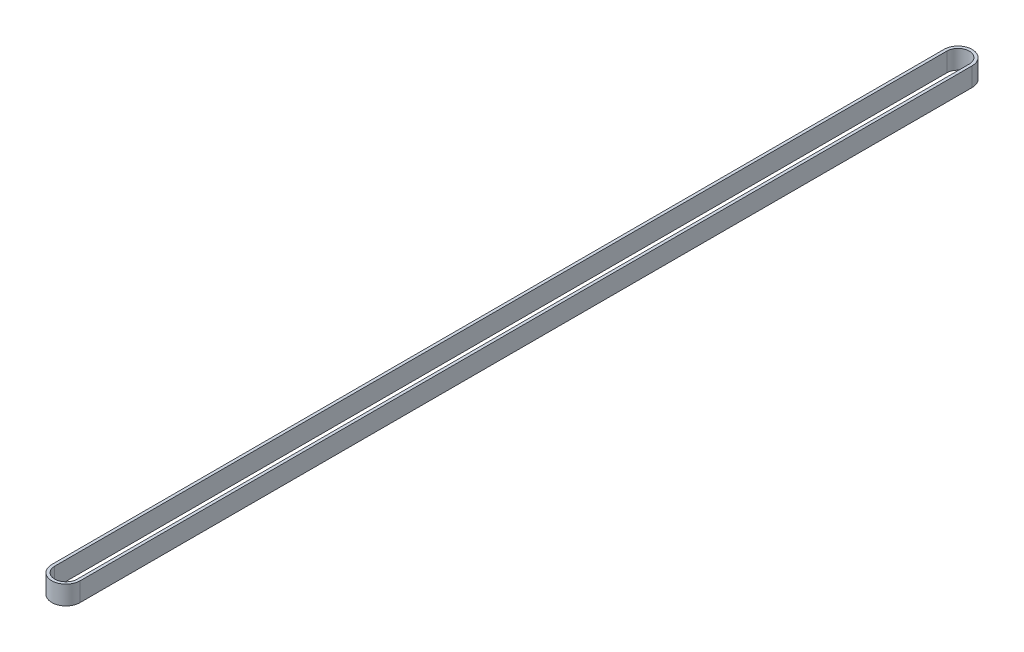
ISO-10303-21;
HEADER;
FILE_DESCRIPTION(('STEP AP214'),'2;1');
FILE_NAME('part.step','',(''),(''),'','','');
FILE_SCHEMA(('AUTOMOTIVE_DESIGN { 1 0 10303 214 1 1 1 1 }'));
ENDSEC;
DATA;
#1=APPLICATION_CONTEXT('core data for automotive mechanical design processes');
#2=APPLICATION_PROTOCOL_DEFINITION('international standard','automotive_design',2000,#1);
#3=PRODUCT_CONTEXT('',#1,'mechanical');
#4=PRODUCT('Part','Part','',(#3));
#5=PRODUCT_RELATED_PRODUCT_CATEGORY('part','',(#4));
#6=PRODUCT_DEFINITION_FORMATION('','',#4);
#7=PRODUCT_DEFINITION_CONTEXT('part definition',#1,'design');
#8=PRODUCT_DEFINITION('design','',#6,#7);
#9=PRODUCT_DEFINITION_SHAPE('','',#8);
#10=(LENGTH_UNIT() NAMED_UNIT(*) SI_UNIT(.MILLI.,.METRE.));
#11=(NAMED_UNIT(*) PLANE_ANGLE_UNIT() SI_UNIT($,.RADIAN.));
#12=(NAMED_UNIT(*) SI_UNIT($,.STERADIAN.) SOLID_ANGLE_UNIT());
#13=UNCERTAINTY_MEASURE_WITH_UNIT(LENGTH_MEASURE(1.E-05),#10,'distance_accuracy_value','');
#14=(GEOMETRIC_REPRESENTATION_CONTEXT(3) GLOBAL_UNCERTAINTY_ASSIGNED_CONTEXT((#13)) GLOBAL_UNIT_ASSIGNED_CONTEXT((#10,
#11,#12)) REPRESENTATION_CONTEXT('',''));
#15=CARTESIAN_POINT('',(0.,0.,0.));
#16=DIRECTION('',(0.,0.,1.));
#17=DIRECTION('',(1.,0.,0.));
#18=AXIS2_PLACEMENT_3D('',#15,#16,#17);
#19=CARTESIAN_POINT('',(305.200009584209,332.350083923345,124.990878974955));
#20=DIRECTION('',(0.,1.,0.));
#21=DIRECTION('',(1.,0.,0.));
#22=AXIS2_PLACEMENT_3D('',#19,#20,#21);
#23=PLANE('',#22);
#24=DIRECTION('',(1.1227384648365E-06,0.,0.99999999999937));
#25=VECTOR('',#24,1.);
#26=CARTESIAN_POINT('',(310.561009584206,332.350083923345,337.077760231628));
#27=LINE('',#26,#25);
#28=CARTESIAN_POINT('',(310.560532225255,332.350083923345,-88.0960143197193));
#29=VERTEX_POINT('',#28);
#30=CARTESIAN_POINT('',(310.561009584206,332.350083923345,337.077760231628));
#31=VERTEX_POINT('',#30);
#32=EDGE_CURVE('E148',#29,#31,#27,.T.);
#33=ORIENTED_EDGE('',*,*,#32,.T.);
#34=CARTESIAN_POINT('',(305.200009584209,332.350083923345,337.077766250629));
#35=DIRECTION('',(0.,-1.,0.));
#36=DIRECTION('',(-0.99999999999937,0.,1.12273846420003E-06));
#37=AXIS2_PLACEMENT_3D('',#34,#35,#36);
#38=CIRCLE('',#37,5.361);
#39=CARTESIAN_POINT('',(299.839009584212,332.350083923345,337.07777226963));
#40=VERTEX_POINT('',#39);
#41=EDGE_CURVE('E135',#31,#40,#38,.T.);
#42=ORIENTED_EDGE('',*,*,#41,.T.);
#43=DIRECTION('',(-1.12273846477905E-06,0.,-0.99999999999937));
#44=VECTOR('',#43,1.);
#45=CARTESIAN_POINT('',(299.838532225261,332.350083923345,-88.0960022817175));
#46=LINE('',#45,#44);
#47=CARTESIAN_POINT('',(299.838532225261,332.350083923345,-88.0960022817175));
#48=VERTEX_POINT('',#47);
#49=EDGE_CURVE('E20',#40,#48,#46,.T.);
#50=ORIENTED_EDGE('',*,*,#49,.T.);
#51=CARTESIAN_POINT('',(305.199532225258,332.350083923345,-88.0960083007184));
#52=DIRECTION('',(0.,-1.,0.));
#53=DIRECTION('',(0.99999999999937,0.,-1.12273845467844E-06));
#54=AXIS2_PLACEMENT_3D('',#51,#52,#53);
#55=CIRCLE('',#54,5.361);
#56=EDGE_CURVE('E98',#48,#29,#55,.T.);
#57=ORIENTED_EDGE('',*,*,#56,.T.);
#58=EDGE_LOOP('',(#33,#42,#50,#57));
#59=FACE_BOUND('',#58,.T.);
#60=DIRECTION('',(-1.12273846483388E-06,0.,-0.99999999999937));
#61=VECTOR('',#60,1.);
#62=CARTESIAN_POINT('',(311.941009584205,332.350083923345,337.077758682249));
#63=LINE('',#62,#61);
#64=CARTESIAN_POINT('',(311.941009584205,332.350083923345,337.077758682249));
#65=VERTEX_POINT('',#64);
#66=CARTESIAN_POINT('',(311.940532225254,332.350083923345,-88.0960158690984));
#67=VERTEX_POINT('',#66);
#68=EDGE_CURVE('E11',#65,#67,#63,.T.);
#69=ORIENTED_EDGE('',*,*,#68,.T.);
#70=CARTESIAN_POINT('',(305.199532225258,332.350083923345,-88.0960083007184));
#71=DIRECTION('',(0.,1.,0.));
#72=DIRECTION('',(0.99999999999937,0.,-1.12273845629736E-06));
#73=AXIS2_PLACEMENT_3D('',#70,#71,#72);
#74=CIRCLE('',#73,6.741);
#75=CARTESIAN_POINT('',(298.458532225262,332.350083923345,-88.0960007323384));
#76=VERTEX_POINT('',#75);
#77=EDGE_CURVE('E176',#67,#76,#74,.T.);
#78=ORIENTED_EDGE('',*,*,#77,.T.);
#79=DIRECTION('',(1.12273846478166E-06,0.,0.99999999999937));
#80=VECTOR('',#79,1.);
#81=CARTESIAN_POINT('',(298.458532225262,332.350083923345,-88.0960007323384));
#82=LINE('',#81,#80);
#83=CARTESIAN_POINT('',(298.459009584213,332.350083923345,337.077773819009));
#84=VERTEX_POINT('',#83);
#85=EDGE_CURVE('E212',#76,#84,#82,.T.);
#86=ORIENTED_EDGE('',*,*,#85,.T.);
#87=CARTESIAN_POINT('',(305.200009584209,332.350083923345,337.077766250629));
#88=DIRECTION('',(0.,1.,0.));
#89=DIRECTION('',(-0.99999999999937,0.,1.12273846386971E-06));
#90=AXIS2_PLACEMENT_3D('',#87,#88,#89);
#91=CIRCLE('',#90,6.741);
#92=EDGE_CURVE('E202',#84,#65,#91,.T.);
#93=ORIENTED_EDGE('',*,*,#92,.T.);
#94=EDGE_LOOP('',(#69,#78,#86,#93));
#95=FACE_BOUND('',#94,.T.);
#96=ADVANCED_FACE('F17',(#59,#95),#23,.T.);
#97=CARTESIAN_POINT('',(311.941009584205,327.850083923345,337.077758682249));
#98=DIRECTION('',(0.99999999999937,0.,-1.12273846483388E-06));
#99=DIRECTION('',(0.,-1.,0.));
#100=AXIS2_PLACEMENT_3D('',#97,#98,#99);
#101=PLANE('',#100);
#102=DIRECTION('',(0.,1.,0.));
#103=VECTOR('',#102,1.);
#104=CARTESIAN_POINT('',(311.940532225254,327.850083923345,-88.0960158690983));
#105=LINE('',#104,#103);
#106=CARTESIAN_POINT('',(311.940532225254,323.350083923345,-88.0960158690984));
#107=VERTEX_POINT('',#106);
#108=EDGE_CURVE('E27',#107,#67,#105,.T.);
#109=ORIENTED_EDGE('',*,*,#108,.T.);
#110=ORIENTED_EDGE('',*,*,#68,.F.);
#111=DIRECTION('',(0.,-1.,0.));
#112=VECTOR('',#111,1.);
#113=CARTESIAN_POINT('',(311.941009584205,327.850083923345,337.077758682249));
#114=LINE('',#113,#112);
#115=CARTESIAN_POINT('',(311.941009584205,323.350083923345,337.077758682249));
#116=VERTEX_POINT('',#115);
#117=EDGE_CURVE('E186',#65,#116,#114,.T.);
#118=ORIENTED_EDGE('',*,*,#117,.T.);
#119=DIRECTION('',(1.12273846483388E-06,0.,0.99999999999937));
#120=VECTOR('',#119,1.);
#121=CARTESIAN_POINT('',(311.941009584205,323.350083923345,337.077758682249));
#122=LINE('',#121,#120);
#123=EDGE_CURVE('E243',#107,#116,#122,.T.);
#124=ORIENTED_EDGE('',*,*,#123,.F.);
#125=EDGE_LOOP('',(#109,#110,#118,#124));
#126=FACE_BOUND('',#125,.T.);
#127=ADVANCED_FACE('F265',(#126),#101,.T.);
#128=CARTESIAN_POINT('',(305.199532225258,327.850083923345,-88.0960083007184));
#129=DIRECTION('',(0.,1.,0.));
#130=DIRECTION('',(0.99999999999937,0.,-1.12273845629736E-06));
#131=AXIS2_PLACEMENT_3D('',#128,#129,#130);
#132=CYLINDRICAL_SURFACE('',#131,6.741);
#133=DIRECTION('',(0.,1.,0.));
#134=VECTOR('',#133,1.);
#135=CARTESIAN_POINT('',(298.458532225262,327.850083923345,-88.0960007323384));
#136=LINE('',#135,#134);
#137=CARTESIAN_POINT('',(298.458532225262,323.350083923345,-88.0960007323384));
#138=VERTEX_POINT('',#137);
#139=EDGE_CURVE('E179',#138,#76,#136,.T.);
#140=ORIENTED_EDGE('',*,*,#139,.T.);
#141=ORIENTED_EDGE('',*,*,#77,.F.);
#142=ORIENTED_EDGE('',*,*,#108,.F.);
#143=CARTESIAN_POINT('',(305.199532225258,323.350083923345,-88.0960083007184));
#144=DIRECTION('',(0.,-1.,0.));
#145=DIRECTION('',(0.99999999999937,0.,-1.12273845629736E-06));
#146=AXIS2_PLACEMENT_3D('',#143,#144,#145);
#147=CIRCLE('',#146,6.741);
#148=EDGE_CURVE('E124',#138,#107,#147,.T.);
#149=ORIENTED_EDGE('',*,*,#148,.F.);
#150=EDGE_LOOP('',(#140,#141,#142,#149));
#151=FACE_BOUND('',#150,.T.);
#152=ADVANCED_FACE('F272',(#151),#132,.T.);
#153=CARTESIAN_POINT('',(298.458532225262,327.850083923345,-88.0960007323383));
#154=DIRECTION('',(-0.99999999999937,0.,1.12273846478166E-06));
#155=DIRECTION('',(0.,1.,0.));
#156=AXIS2_PLACEMENT_3D('',#153,#154,#155);
#157=PLANE('',#156);
#158=DIRECTION('',(0.,1.,0.));
#159=VECTOR('',#158,1.);
#160=CARTESIAN_POINT('',(298.459009584213,327.850083923345,337.077773819009));
#161=LINE('',#160,#159);
#162=CARTESIAN_POINT('',(298.459009584213,323.350083923345,337.077773819009));
#163=VERTEX_POINT('',#162);
#164=EDGE_CURVE('E205',#163,#84,#161,.T.);
#165=ORIENTED_EDGE('',*,*,#164,.T.);
#166=ORIENTED_EDGE('',*,*,#85,.F.);
#167=ORIENTED_EDGE('',*,*,#139,.F.);
#168=DIRECTION('',(-1.12273846478166E-06,0.,-0.99999999999937));
#169=VECTOR('',#168,1.);
#170=CARTESIAN_POINT('',(298.458532225262,323.350083923345,-88.0960007323384));
#171=LINE('',#170,#169);
#172=EDGE_CURVE('E132',#163,#138,#171,.T.);
#173=ORIENTED_EDGE('',*,*,#172,.F.);
#174=EDGE_LOOP('',(#165,#166,#167,#173));
#175=FACE_BOUND('',#174,.T.);
#176=ADVANCED_FACE('F282',(#175),#157,.T.);
#177=CARTESIAN_POINT('',(305.200009584209,327.850083923345,337.077766250629));
#178=DIRECTION('',(0.,1.,0.));
#179=DIRECTION('',(-0.99999999999937,0.,1.12273846386971E-06));
#180=AXIS2_PLACEMENT_3D('',#177,#178,#179);
#181=CYLINDRICAL_SURFACE('',#180,6.741);
#182=ORIENTED_EDGE('',*,*,#117,.F.);
#183=ORIENTED_EDGE('',*,*,#92,.F.);
#184=ORIENTED_EDGE('',*,*,#164,.F.);
#185=CARTESIAN_POINT('',(305.200009584209,323.350083923345,337.077766250629));
#186=DIRECTION('',(0.,-1.,0.));
#187=DIRECTION('',(-0.99999999999937,0.,1.12273846386971E-06));
#188=AXIS2_PLACEMENT_3D('',#185,#186,#187);
#189=CIRCLE('',#188,6.741);
#190=EDGE_CURVE('E236',#116,#163,#189,.T.);
#191=ORIENTED_EDGE('',*,*,#190,.F.);
#192=EDGE_LOOP('',(#182,#183,#184,#191));
#193=FACE_BOUND('',#192,.T.);
#194=ADVANCED_FACE('F286',(#193),#181,.T.);
#195=CARTESIAN_POINT('',(310.560532225255,327.850083923345,-88.0960143197192));
#196=DIRECTION('',(-0.99999999999937,0.,1.1227384648365E-06));
#197=DIRECTION('',(0.,1.,0.));
#198=AXIS2_PLACEMENT_3D('',#195,#196,#197);
#199=PLANE('',#198);
#200=DIRECTION('',(0.,1.,0.));
#201=VECTOR('',#200,1.);
#202=CARTESIAN_POINT('',(310.561009584206,327.850083923345,337.077760231628));
#203=LINE('',#202,#201);
#204=CARTESIAN_POINT('',(310.561009584206,323.350083923345,337.077760231628));
#205=VERTEX_POINT('',#204);
#206=EDGE_CURVE('E142',#205,#31,#203,.T.);
#207=ORIENTED_EDGE('',*,*,#206,.T.);
#208=ORIENTED_EDGE('',*,*,#32,.F.);
#209=DIRECTION('',(0.,-1.,0.));
#210=VECTOR('',#209,1.);
#211=CARTESIAN_POINT('',(310.560532225255,327.850083923345,-88.0960143197192));
#212=LINE('',#211,#210);
#213=CARTESIAN_POINT('',(310.560532225255,323.350083923345,-88.0960143197193));
#214=VERTEX_POINT('',#213);
#215=EDGE_CURVE('E128',#29,#214,#212,.T.);
#216=ORIENTED_EDGE('',*,*,#215,.T.);
#217=DIRECTION('',(-1.1227384648365E-06,0.,-0.99999999999937));
#218=VECTOR('',#217,1.);
#219=CARTESIAN_POINT('',(310.561009584206,323.350083923345,337.077760231628));
#220=LINE('',#219,#218);
#221=EDGE_CURVE('E117',#205,#214,#220,.T.);
#222=ORIENTED_EDGE('',*,*,#221,.F.);
#223=EDGE_LOOP('',(#207,#208,#216,#222));
#224=FACE_BOUND('',#223,.T.);
#225=ADVANCED_FACE('F157',(#224),#199,.T.);
#226=CARTESIAN_POINT('',(305.200009584209,327.850083923345,337.077766250629));
#227=DIRECTION('',(0.,1.,0.));
#228=DIRECTION('',(-0.99999999999937,0.,1.12273846420003E-06));
#229=AXIS2_PLACEMENT_3D('',#226,#227,#228);
#230=CYLINDRICAL_SURFACE('',#229,5.361);
#231=DIRECTION('',(0.,1.,0.));
#232=VECTOR('',#231,1.);
#233=CARTESIAN_POINT('',(299.839009584212,327.850083923345,337.07777226963));
#234=LINE('',#233,#232);
#235=CARTESIAN_POINT('',(299.839009584212,323.350083923345,337.07777226963));
#236=VERTEX_POINT('',#235);
#237=EDGE_CURVE('E107',#236,#40,#234,.T.);
#238=ORIENTED_EDGE('',*,*,#237,.T.);
#239=ORIENTED_EDGE('',*,*,#41,.F.);
#240=ORIENTED_EDGE('',*,*,#206,.F.);
#241=CARTESIAN_POINT('',(305.200009584209,323.350083923345,337.077766250629));
#242=DIRECTION('',(0.,1.,0.));
#243=DIRECTION('',(-0.99999999999937,0.,1.12273846420003E-06));
#244=AXIS2_PLACEMENT_3D('',#241,#242,#243);
#245=CIRCLE('',#244,5.361);
#246=EDGE_CURVE('E112',#236,#205,#245,.T.);
#247=ORIENTED_EDGE('',*,*,#246,.F.);
#248=EDGE_LOOP('',(#238,#239,#240,#247));
#249=FACE_BOUND('',#248,.T.);
#250=ADVANCED_FACE('F151',(#249),#230,.F.);
#251=CARTESIAN_POINT('',(299.839009584212,327.850083923345,337.07777226963));
#252=DIRECTION('',(0.99999999999937,0.,-1.12273846477905E-06));
#253=DIRECTION('',(0.,-1.,0.));
#254=AXIS2_PLACEMENT_3D('',#251,#252,#253);
#255=PLANE('',#254);
#256=DIRECTION('',(0.,1.,0.));
#257=VECTOR('',#256,1.);
#258=CARTESIAN_POINT('',(299.838532225261,327.850083923345,-88.0960022817175));
#259=LINE('',#258,#257);
#260=CARTESIAN_POINT('',(299.838532225261,323.350083923345,-88.0960022817175));
#261=VERTEX_POINT('',#260);
#262=EDGE_CURVE('E90',#261,#48,#259,.T.);
#263=ORIENTED_EDGE('',*,*,#262,.T.);
#264=ORIENTED_EDGE('',*,*,#49,.F.);
#265=ORIENTED_EDGE('',*,*,#237,.F.);
#266=DIRECTION('',(1.12273846477905E-06,0.,0.99999999999937));
#267=VECTOR('',#266,1.);
#268=CARTESIAN_POINT('',(299.838532225261,323.350083923345,-88.0960022817175));
#269=LINE('',#268,#267);
#270=EDGE_CURVE('E104',#261,#236,#269,.T.);
#271=ORIENTED_EDGE('',*,*,#270,.F.);
#272=EDGE_LOOP('',(#263,#264,#265,#271));
#273=FACE_BOUND('',#272,.T.);
#274=ADVANCED_FACE('F105',(#273),#255,.T.);
#275=CARTESIAN_POINT('',(305.199532225258,327.850083923345,-88.0960083007184));
#276=DIRECTION('',(0.,1.,0.));
#277=DIRECTION('',(0.99999999999937,0.,-1.12273845467844E-06));
#278=AXIS2_PLACEMENT_3D('',#275,#276,#277);
#279=CYLINDRICAL_SURFACE('',#278,5.361);
#280=ORIENTED_EDGE('',*,*,#215,.F.);
#281=ORIENTED_EDGE('',*,*,#56,.F.);
#282=ORIENTED_EDGE('',*,*,#262,.F.);
#283=CARTESIAN_POINT('',(305.199532225258,323.350083923345,-88.0960083007184));
#284=DIRECTION('',(0.,1.,0.));
#285=DIRECTION('',(0.99999999999937,0.,-1.12273845467844E-06));
#286=AXIS2_PLACEMENT_3D('',#283,#284,#285);
#287=CIRCLE('',#286,5.361);
#288=EDGE_CURVE('E95',#214,#261,#287,.T.);
#289=ORIENTED_EDGE('',*,*,#288,.F.);
#290=EDGE_LOOP('',(#280,#281,#282,#289));
#291=FACE_BOUND('',#290,.T.);
#292=ADVANCED_FACE('F93',(#291),#279,.F.);
#293=CARTESIAN_POINT('',(305.200009584209,323.350083923345,124.990878974955));
#294=DIRECTION('',(0.,1.,0.));
#295=DIRECTION('',(1.,0.,0.));
#296=AXIS2_PLACEMENT_3D('',#293,#294,#295);
#297=PLANE('',#296);
#298=ORIENTED_EDGE('',*,*,#221,.T.);
#299=ORIENTED_EDGE('',*,*,#288,.T.);
#300=ORIENTED_EDGE('',*,*,#270,.T.);
#301=ORIENTED_EDGE('',*,*,#246,.T.);
#302=EDGE_LOOP('',(#298,#299,#300,#301));
#303=FACE_BOUND('',#302,.T.);
#304=ORIENTED_EDGE('',*,*,#123,.T.);
#305=ORIENTED_EDGE('',*,*,#190,.T.);
#306=ORIENTED_EDGE('',*,*,#172,.T.);
#307=ORIENTED_EDGE('',*,*,#148,.T.);
#308=EDGE_LOOP('',(#304,#305,#306,#307));
#309=FACE_BOUND('',#308,.T.);
#310=ADVANCED_FACE('F114',(#303,#309),#297,.F.);
#311=CLOSED_SHELL('',(#96,#127,#152,#176,#194,#225,#250,#274,#292,#310));
#312=MANIFOLD_SOLID_BREP('B1',#311);
#313=ADVANCED_BREP_SHAPE_REPRESENTATION('',(#18,#312),#14);
#314=SHAPE_DEFINITION_REPRESENTATION(#9,#313);
ENDSEC;
END-ISO-10303-21;
